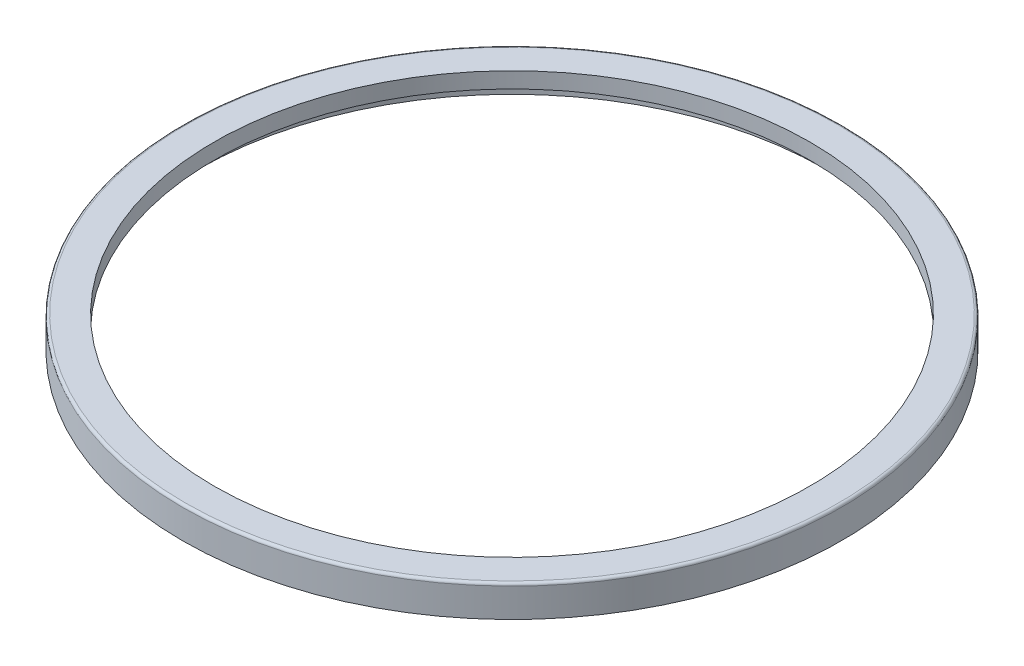
ISO-10303-21;
HEADER;
FILE_DESCRIPTION(('STEP AP214'),'2;1');
FILE_NAME('part.step','',(''),(''),'','','');
FILE_SCHEMA(('AUTOMOTIVE_DESIGN { 1 0 10303 214 1 1 1 1 }'));
ENDSEC;
DATA;
#1=APPLICATION_CONTEXT('core data for automotive mechanical design processes');
#2=APPLICATION_PROTOCOL_DEFINITION('international standard','automotive_design',2000,#1);
#3=PRODUCT_CONTEXT('',#1,'mechanical');
#4=PRODUCT('Part','Part','',(#3));
#5=PRODUCT_RELATED_PRODUCT_CATEGORY('part','',(#4));
#6=PRODUCT_DEFINITION_FORMATION('','',#4);
#7=PRODUCT_DEFINITION_CONTEXT('part definition',#1,'design');
#8=PRODUCT_DEFINITION('design','',#6,#7);
#9=PRODUCT_DEFINITION_SHAPE('','',#8);
#10=(LENGTH_UNIT() NAMED_UNIT(*) SI_UNIT(.MILLI.,.METRE.));
#11=(NAMED_UNIT(*) PLANE_ANGLE_UNIT() SI_UNIT($,.RADIAN.));
#12=(NAMED_UNIT(*) SI_UNIT($,.STERADIAN.) SOLID_ANGLE_UNIT());
#13=UNCERTAINTY_MEASURE_WITH_UNIT(LENGTH_MEASURE(1.E-05),#10,'distance_accuracy_value','');
#14=(GEOMETRIC_REPRESENTATION_CONTEXT(3) GLOBAL_UNCERTAINTY_ASSIGNED_CONTEXT((#13)) GLOBAL_UNIT_ASSIGNED_CONTEXT((#10,
#11,#12)) REPRESENTATION_CONTEXT('',''));
#15=CARTESIAN_POINT('',(0.,0.,0.));
#16=DIRECTION('',(0.,0.,1.));
#17=DIRECTION('',(1.,0.,0.));
#18=AXIS2_PLACEMENT_3D('',#15,#16,#17);
#19=CARTESIAN_POINT('',(0.,0.,0.));
#20=DIRECTION('',(0.,-1.,0.));
#21=DIRECTION('',(0.,0.,-1.));
#22=AXIS2_PLACEMENT_3D('',#19,#20,#21);
#23=CYLINDRICAL_SURFACE('',#22,57.56402);
#24=CARTESIAN_POINT('',(0.,0.,0.));
#25=DIRECTION('',(0.,-1.,0.));
#26=DIRECTION('',(0.,0.,-1.));
#27=AXIS2_PLACEMENT_3D('',#24,#25,#26);
#28=CIRCLE('',#27,57.56402);
#29=CARTESIAN_POINT('',(0.,0.,-57.56402));
#30=VERTEX_POINT('',#29);
#31=EDGE_CURVE('E52',#30,#30,#28,.T.);
#32=ORIENTED_EDGE('',*,*,#31,.F.);
#33=EDGE_LOOP('',(#32));
#34=FACE_BOUND('',#33,.T.);
#35=CARTESIAN_POINT('',(0.,-3.048,0.));
#36=DIRECTION('',(0.,-1.,0.));
#37=DIRECTION('',(0.,0.,-1.));
#38=AXIS2_PLACEMENT_3D('',#35,#36,#37);
#39=CIRCLE('',#38,57.56402);
#40=CARTESIAN_POINT('',(0.,-3.048,-57.56402));
#41=VERTEX_POINT('',#40);
#42=EDGE_CURVE('E61',#41,#41,#39,.T.);
#43=ORIENTED_EDGE('',*,*,#42,.T.);
#44=EDGE_LOOP('',(#43));
#45=FACE_BOUND('',#44,.T.);
#46=ADVANCED_FACE('F32',(#34,#45),#23,.F.);
#47=CARTESIAN_POINT('',(-57.56402,0.,0.));
#48=DIRECTION('',(0.,-1.,0.));
#49=DIRECTION('',(0.,0.,-1.));
#50=AXIS2_PLACEMENT_3D('',#47,#48,#49);
#51=PLANE('',#50);
#52=CARTESIAN_POINT('',(0.,0.,0.));
#53=DIRECTION('',(0.,-1.,0.));
#54=DIRECTION('',(0.,0.,-1.));
#55=AXIS2_PLACEMENT_3D('',#52,#53,#54);
#56=CIRCLE('',#55,63.15202);
#57=CARTESIAN_POINT('',(0.,0.,-63.15202));
#58=VERTEX_POINT('',#57);
#59=EDGE_CURVE('E10',#58,#58,#56,.F.);
#60=ORIENTED_EDGE('',*,*,#59,.T.);
#61=EDGE_LOOP('',(#60));
#62=FACE_BOUND('',#61,.T.);
#63=ORIENTED_EDGE('',*,*,#31,.T.);
#64=EDGE_LOOP('',(#63));
#65=FACE_BOUND('',#64,.T.);
#66=ADVANCED_FACE('F81',(#62,#65),#51,.F.);
#67=CARTESIAN_POINT('',(0.,0.,0.));
#68=DIRECTION('',(0.,-1.,0.));
#69=DIRECTION('',(0.,0.,-1.));
#70=AXIS2_PLACEMENT_3D('',#67,#68,#69);
#71=CYLINDRICAL_SURFACE('',#70,63.66002);
#72=CARTESIAN_POINT('',(0.,-0.508000000000004,0.));
#73=DIRECTION('',(0.,-1.,0.));
#74=DIRECTION('',(0.,0.,-1.));
#75=AXIS2_PLACEMENT_3D('',#72,#73,#74);
#76=CIRCLE('',#75,63.66002);
#77=CARTESIAN_POINT('',(0.,-0.508000000000004,-63.66002));
#78=VERTEX_POINT('',#77);
#79=EDGE_CURVE('E39',#78,#78,#76,.T.);
#80=ORIENTED_EDGE('',*,*,#79,.T.);
#81=EDGE_LOOP('',(#80));
#82=FACE_BOUND('',#81,.T.);
#83=CARTESIAN_POINT('',(0.,-6.09600000000001,0.));
#84=DIRECTION('',(0.,-1.,0.));
#85=DIRECTION('',(0.,0.,-1.));
#86=AXIS2_PLACEMENT_3D('',#83,#84,#85);
#87=CIRCLE('',#86,63.66002);
#88=CARTESIAN_POINT('',(0.,-6.09600000000001,-63.66002));
#89=VERTEX_POINT('',#88);
#90=EDGE_CURVE('E55',#89,#89,#87,.T.);
#91=ORIENTED_EDGE('',*,*,#90,.F.);
#92=EDGE_LOOP('',(#91));
#93=FACE_BOUND('',#92,.T.);
#94=ADVANCED_FACE('F87',(#82,#93),#71,.T.);
#95=CARTESIAN_POINT('',(-63.66002,-6.09600000000001,0.));
#96=DIRECTION('',(0.,1.,0.));
#97=DIRECTION('',(0.,0.,1.));
#98=AXIS2_PLACEMENT_3D('',#95,#96,#97);
#99=PLANE('',#98);
#100=CARTESIAN_POINT('',(0.,-6.09600000000001,0.));
#101=DIRECTION('',(0.,-1.,0.));
#102=DIRECTION('',(0.,0.,-1.));
#103=AXIS2_PLACEMENT_3D('',#100,#101,#102);
#104=CIRCLE('',#103,60.61202);
#105=CARTESIAN_POINT('',(0.,-6.09600000000001,-60.61202));
#106=VERTEX_POINT('',#105);
#107=EDGE_CURVE('E58',#106,#106,#104,.T.);
#108=ORIENTED_EDGE('',*,*,#107,.F.);
#109=EDGE_LOOP('',(#108));
#110=FACE_BOUND('',#109,.T.);
#111=ORIENTED_EDGE('',*,*,#90,.T.);
#112=EDGE_LOOP('',(#111));
#113=FACE_BOUND('',#112,.T.);
#114=ADVANCED_FACE('F77',(#110,#113),#99,.F.);
#115=CARTESIAN_POINT('',(0.,0.,0.));
#116=DIRECTION('',(0.,-1.,0.));
#117=DIRECTION('',(0.,0.,-1.));
#118=AXIS2_PLACEMENT_3D('',#115,#116,#117);
#119=CYLINDRICAL_SURFACE('',#118,60.61202);
#120=CARTESIAN_POINT('',(0.,-4.6355,0.));
#121=DIRECTION('',(0.,1.,0.));
#122=DIRECTION('',(0.,0.,1.));
#123=AXIS2_PLACEMENT_3D('',#120,#121,#122);
#124=CIRCLE('',#123,60.61202);
#125=CARTESIAN_POINT('',(0.,-4.6355,60.61202));
#126=VERTEX_POINT('',#125);
#127=EDGE_CURVE('E43',#126,#126,#124,.T.);
#128=ORIENTED_EDGE('',*,*,#127,.T.);
#129=EDGE_LOOP('',(#128));
#130=FACE_BOUND('',#129,.T.);
#131=ORIENTED_EDGE('',*,*,#107,.T.);
#132=EDGE_LOOP('',(#131));
#133=FACE_BOUND('',#132,.T.);
#134=ADVANCED_FACE('F69',(#130,#133),#119,.F.);
#135=CARTESIAN_POINT('',(-60.61202,-3.048,0.));
#136=DIRECTION('',(0.,1.,0.));
#137=DIRECTION('',(0.,0.,1.));
#138=AXIS2_PLACEMENT_3D('',#135,#136,#137);
#139=PLANE('',#138);
#140=CARTESIAN_POINT('',(0.,-3.048,0.));
#141=DIRECTION('',(0.,1.,0.));
#142=DIRECTION('',(0.,0.,1.));
#143=AXIS2_PLACEMENT_3D('',#140,#141,#142);
#144=CIRCLE('',#143,59.02452);
#145=CARTESIAN_POINT('',(0.,-3.048,59.02452));
#146=VERTEX_POINT('',#145);
#147=EDGE_CURVE('E47',#146,#146,#144,.F.);
#148=ORIENTED_EDGE('',*,*,#147,.T.);
#149=EDGE_LOOP('',(#148));
#150=FACE_BOUND('',#149,.T.);
#151=ORIENTED_EDGE('',*,*,#42,.F.);
#152=EDGE_LOOP('',(#151));
#153=FACE_BOUND('',#152,.T.);
#154=ADVANCED_FACE('F66',(#150,#153),#139,.F.);
#155=CARTESIAN_POINT('',(0.,-4.6355,0.));
#156=DIRECTION('',(0.,1.,0.));
#157=DIRECTION('',(0.,0.,1.));
#158=AXIS2_PLACEMENT_3D('',#155,#156,#157);
#159=TOROIDAL_SURFACE('',#158,59.02452,1.5875);
#160=ORIENTED_EDGE('',*,*,#127,.F.);
#161=EDGE_LOOP('',(#160));
#162=FACE_BOUND('',#161,.T.);
#163=ORIENTED_EDGE('',*,*,#147,.F.);
#164=EDGE_LOOP('',(#163));
#165=FACE_BOUND('',#164,.T.);
#166=ADVANCED_FACE('F68',(#162,#165),#159,.F.);
#167=CARTESIAN_POINT('',(0.,-0.508000000000004,0.));
#168=DIRECTION('',(0.,-1.,0.));
#169=DIRECTION('',(0.,0.,-1.));
#170=AXIS2_PLACEMENT_3D('',#167,#168,#169);
#171=TOROIDAL_SURFACE('',#170,63.15202,0.508);
#172=ORIENTED_EDGE('',*,*,#59,.F.);
#173=EDGE_LOOP('',(#172));
#174=FACE_BOUND('',#173,.T.);
#175=ORIENTED_EDGE('',*,*,#79,.F.);
#176=EDGE_LOOP('',(#175));
#177=FACE_BOUND('',#176,.T.);
#178=ADVANCED_FACE('F34',(#174,#177),#171,.T.);
#179=CLOSED_SHELL('',(#46,#66,#94,#114,#134,#154,#166,#178));
#180=MANIFOLD_SOLID_BREP('B2',#179);
#181=ADVANCED_BREP_SHAPE_REPRESENTATION('',(#18,#180),#14);
#182=SHAPE_DEFINITION_REPRESENTATION(#9,#181);
ENDSEC;
END-ISO-10303-21;
